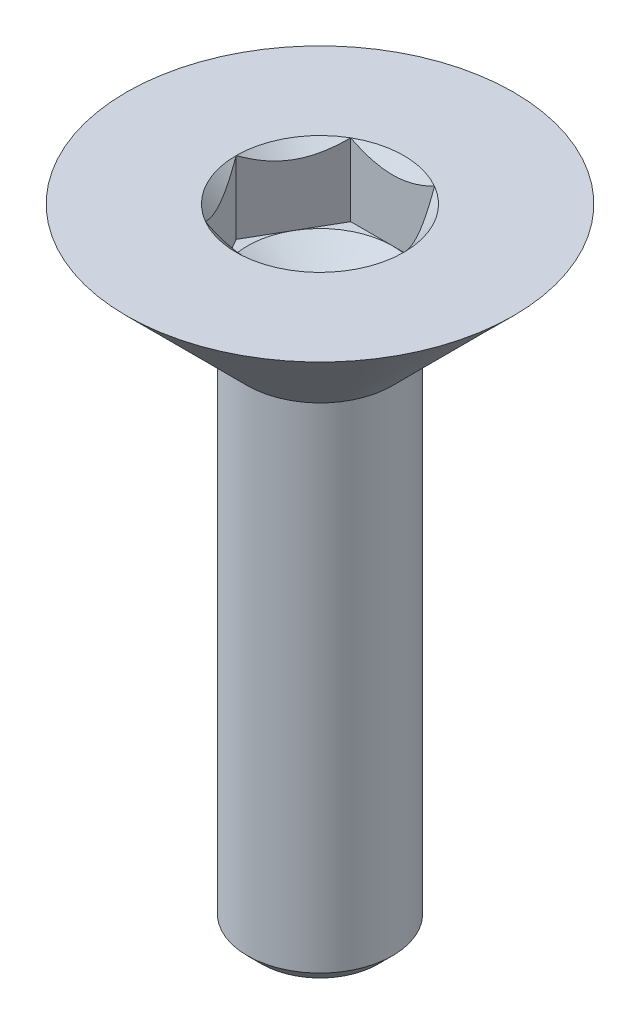
ISO-10303-21;
HEADER;
FILE_DESCRIPTION(('STEP AP214'),'2;1');
FILE_NAME('part.step','',(''),(''),'','','');
FILE_SCHEMA(('AUTOMOTIVE_DESIGN { 1 0 10303 214 1 1 1 1 }'));
ENDSEC;
DATA;
#1=APPLICATION_CONTEXT('core data for automotive mechanical design processes');
#2=APPLICATION_PROTOCOL_DEFINITION('international standard','automotive_design',2000,#1);
#3=PRODUCT_CONTEXT('',#1,'mechanical');
#4=PRODUCT('Part','Part','',(#3));
#5=PRODUCT_RELATED_PRODUCT_CATEGORY('part','',(#4));
#6=PRODUCT_DEFINITION_FORMATION('','',#4);
#7=PRODUCT_DEFINITION_CONTEXT('part definition',#1,'design');
#8=PRODUCT_DEFINITION('design','',#6,#7);
#9=PRODUCT_DEFINITION_SHAPE('','',#8);
#10=(LENGTH_UNIT() NAMED_UNIT(*) SI_UNIT(.MILLI.,.METRE.));
#11=(NAMED_UNIT(*) PLANE_ANGLE_UNIT() SI_UNIT($,.RADIAN.));
#12=(NAMED_UNIT(*) SI_UNIT($,.STERADIAN.) SOLID_ANGLE_UNIT());
#13=UNCERTAINTY_MEASURE_WITH_UNIT(LENGTH_MEASURE(1.E-05),#10,'distance_accuracy_value','');
#14=(GEOMETRIC_REPRESENTATION_CONTEXT(3) GLOBAL_UNCERTAINTY_ASSIGNED_CONTEXT((#13)) GLOBAL_UNIT_ASSIGNED_CONTEXT((#10,
#11,#12)) REPRESENTATION_CONTEXT('',''));
#15=CARTESIAN_POINT('',(0.,0.,0.));
#16=DIRECTION('',(0.,0.,1.));
#17=DIRECTION('',(1.,0.,0.));
#18=AXIS2_PLACEMENT_3D('',#15,#16,#17);
#19=CARTESIAN_POINT('',(3.46410161513775,2.,0.));
#20=DIRECTION('',(0.,1.,0.));
#21=DIRECTION('',(0.,0.,1.));
#22=AXIS2_PLACEMENT_3D('',#19,#20,#21);
#23=PLANE('',#22);
#24=CARTESIAN_POINT('',(0.,2.,0.));
#25=DIRECTION('',(0.,1.,0.));
#26=DIRECTION('',(0.,0.,1.));
#27=AXIS2_PLACEMENT_3D('',#24,#25,#26);
#28=CIRCLE('',#27,3.);
#29=CARTESIAN_POINT('',(0.,2.,3.));
#30=VERTEX_POINT('',#29);
#31=CARTESIAN_POINT('',(2.59807621135332,2.,1.5));
#32=VERTEX_POINT('',#31);
#33=EDGE_CURVE('E95',#30,#32,#28,.T.);
#34=ORIENTED_EDGE('',*,*,#33,.F.);
#35=DIRECTION('',(1.,0.,0.));
#36=VECTOR('',#35,1.);
#37=CARTESIAN_POINT('',(-1.73205080756888,2.,3.));
#38=LINE('',#37,#36);
#39=CARTESIAN_POINT('',(1.73205080756887,2.,3.));
#40=VERTEX_POINT('',#39);
#41=EDGE_CURVE('E39',#30,#40,#38,.T.);
#42=ORIENTED_EDGE('',*,*,#41,.T.);
#43=DIRECTION('',(0.5,0.,-0.866025403784439));
#44=VECTOR('',#43,1.);
#45=CARTESIAN_POINT('',(1.73205080756887,2.,3.));
#46=LINE('',#45,#44);
#47=EDGE_CURVE('E116',#40,#32,#46,.T.);
#48=ORIENTED_EDGE('',*,*,#47,.T.);
#49=EDGE_LOOP('',(#34,#42,#48));
#50=FACE_BOUND('',#49,.T.);
#51=ADVANCED_FACE('F16',(#50),#23,.T.);
#52=CARTESIAN_POINT('',(0.,2.,0.));
#53=DIRECTION('',(0.,1.,0.));
#54=DIRECTION('',(0.,0.,1.));
#55=AXIS2_PLACEMENT_3D('',#52,#53,#54);
#56=CIRCLE('',#55,3.);
#57=CARTESIAN_POINT('',(2.59807621135332,2.,-1.5));
#58=VERTEX_POINT('',#57);
#59=EDGE_CURVE('E97',#32,#58,#56,.T.);
#60=ORIENTED_EDGE('',*,*,#59,.F.);
#61=CARTESIAN_POINT('',(3.46410161513775,2.,0.));
#62=VERTEX_POINT('',#61);
#63=EDGE_CURVE('E106',#32,#62,#46,.T.);
#64=ORIENTED_EDGE('',*,*,#63,.T.);
#65=DIRECTION('',(-0.5,0.,-0.866025403784438));
#66=VECTOR('',#65,1.);
#67=CARTESIAN_POINT('',(3.46410161513775,2.,0.));
#68=LINE('',#67,#66);
#69=EDGE_CURVE('E109',#62,#58,#68,.T.);
#70=ORIENTED_EDGE('',*,*,#69,.T.);
#71=EDGE_LOOP('',(#60,#64,#70));
#72=FACE_BOUND('',#71,.T.);
#73=ADVANCED_FACE('F105',(#72),#23,.T.);
#74=CARTESIAN_POINT('',(0.,2.,-3.));
#75=VERTEX_POINT('',#74);
#76=EDGE_CURVE('E110',#58,#75,#56,.T.);
#77=ORIENTED_EDGE('',*,*,#76,.F.);
#78=CARTESIAN_POINT('',(1.73205080756887,2.,-3.));
#79=VERTEX_POINT('',#78);
#80=EDGE_CURVE('E122',#58,#79,#68,.T.);
#81=ORIENTED_EDGE('',*,*,#80,.T.);
#82=DIRECTION('',(-1.,0.,0.));
#83=VECTOR('',#82,1.);
#84=CARTESIAN_POINT('',(1.73205080756887,2.,-3.));
#85=LINE('',#84,#83);
#86=EDGE_CURVE('E128',#79,#75,#85,.T.);
#87=ORIENTED_EDGE('',*,*,#86,.T.);
#88=EDGE_LOOP('',(#77,#81,#87));
#89=FACE_BOUND('',#88,.T.);
#90=ADVANCED_FACE('F181',(#89),#23,.T.);
#91=CARTESIAN_POINT('',(-2.59807621135332,2.,-1.5));
#92=VERTEX_POINT('',#91);
#93=EDGE_CURVE('E211',#75,#92,#56,.T.);
#94=ORIENTED_EDGE('',*,*,#93,.F.);
#95=CARTESIAN_POINT('',(-1.73205080756888,2.,-3.));
#96=VERTEX_POINT('',#95);
#97=EDGE_CURVE('E127',#75,#96,#85,.T.);
#98=ORIENTED_EDGE('',*,*,#97,.T.);
#99=DIRECTION('',(-0.5,0.,0.866025403784439));
#100=VECTOR('',#99,1.);
#101=CARTESIAN_POINT('',(-1.73205080756888,2.,-3.));
#102=LINE('',#101,#100);
#103=EDGE_CURVE('E132',#96,#92,#102,.T.);
#104=ORIENTED_EDGE('',*,*,#103,.T.);
#105=EDGE_LOOP('',(#94,#98,#104));
#106=FACE_BOUND('',#105,.T.);
#107=ADVANCED_FACE('F199',(#106),#23,.T.);
#108=CARTESIAN_POINT('',(-2.59807621135332,2.,1.5));
#109=VERTEX_POINT('',#108);
#110=EDGE_CURVE('E31',#92,#109,#56,.T.);
#111=ORIENTED_EDGE('',*,*,#110,.F.);
#112=CARTESIAN_POINT('',(-3.46410161513775,2.,0.));
#113=VERTEX_POINT('',#112);
#114=EDGE_CURVE('E131',#92,#113,#102,.T.);
#115=ORIENTED_EDGE('',*,*,#114,.T.);
#116=DIRECTION('',(0.5,0.,0.866025403784439));
#117=VECTOR('',#116,1.);
#118=CARTESIAN_POINT('',(-3.46410161513775,2.,0.));
#119=LINE('',#118,#117);
#120=EDGE_CURVE('E136',#113,#109,#119,.T.);
#121=ORIENTED_EDGE('',*,*,#120,.T.);
#122=EDGE_LOOP('',(#111,#115,#121));
#123=FACE_BOUND('',#122,.T.);
#124=ADVANCED_FACE('F188',(#123),#23,.T.);
#125=CARTESIAN_POINT('',(0.,0.,0.));
#126=DIRECTION('',(0.,1.,0.));
#127=DIRECTION('',(0.,0.,1.));
#128=AXIS2_PLACEMENT_3D('',#125,#126,#127);
#129=CONICAL_SURFACE('',#128,3.,0.78539816339745);
#130=CARTESIAN_POINT('',(0.,5.,0.));
#131=DIRECTION('',(0.,1.,0.));
#132=DIRECTION('',(0.,0.,1.));
#133=AXIS2_PLACEMENT_3D('',#130,#131,#132);
#134=CIRCLE('',#133,8.);
#135=CARTESIAN_POINT('',(0.,5.,8.));
#136=VERTEX_POINT('',#135);
#137=EDGE_CURVE('E160',#136,#136,#134,.T.);
#138=ORIENTED_EDGE('',*,*,#137,.F.);
#139=EDGE_LOOP('',(#138));
#140=FACE_BOUND('',#139,.T.);
#141=CARTESIAN_POINT('',(0.,0.,0.));
#142=DIRECTION('',(0.,1.,0.));
#143=DIRECTION('',(0.,0.,1.));
#144=AXIS2_PLACEMENT_3D('',#141,#142,#143);
#145=CIRCLE('',#144,3.);
#146=CARTESIAN_POINT('',(0.,0.,3.));
#147=VERTEX_POINT('',#146);
#148=EDGE_CURVE('E144',#147,#147,#145,.T.);
#149=ORIENTED_EDGE('',*,*,#148,.T.);
#150=EDGE_LOOP('',(#149));
#151=FACE_BOUND('',#150,.T.);
#152=ADVANCED_FACE('F18',(#140,#151),#129,.T.);
#153=CARTESIAN_POINT('',(0.,5.,0.));
#154=DIRECTION('',(0.,1.,0.));
#155=DIRECTION('',(0.,0.,1.));
#156=AXIS2_PLACEMENT_3D('',#153,#154,#155);
#157=PLANE('',#156);
#158=CARTESIAN_POINT('',(0.,5.,0.));
#159=DIRECTION('',(0.,1.,0.));
#160=DIRECTION('',(0.,0.,1.));
#161=AXIS2_PLACEMENT_3D('',#158,#159,#160);
#162=CIRCLE('',#161,3.46410161513775);
#163=CARTESIAN_POINT('',(1.73205080756888,5.,3.));
#164=VERTEX_POINT('',#163);
#165=CARTESIAN_POINT('',(3.46410161513775,5.,0.));
#166=VERTEX_POINT('',#165);
#167=EDGE_CURVE('E100',#164,#166,#162,.T.);
#168=ORIENTED_EDGE('',*,*,#167,.F.);
#169=CARTESIAN_POINT('',(0.,5.,0.));
#170=DIRECTION('',(0.,1.,0.));
#171=DIRECTION('',(0.,0.,1.));
#172=AXIS2_PLACEMENT_3D('',#169,#170,#171);
#173=CIRCLE('',#172,3.46410161513775);
#174=CARTESIAN_POINT('',(-1.73205080756888,5.,3.));
#175=VERTEX_POINT('',#174);
#176=EDGE_CURVE('E120',#175,#164,#173,.T.);
#177=ORIENTED_EDGE('',*,*,#176,.F.);
#178=CARTESIAN_POINT('',(0.,5.,0.));
#179=DIRECTION('',(0.,1.,0.));
#180=DIRECTION('',(0.,0.,1.));
#181=AXIS2_PLACEMENT_3D('',#178,#179,#180);
#182=CIRCLE('',#181,3.46410161513775);
#183=CARTESIAN_POINT('',(-3.46410161513775,5.,0.));
#184=VERTEX_POINT('',#183);
#185=EDGE_CURVE('E236',#184,#175,#182,.T.);
#186=ORIENTED_EDGE('',*,*,#185,.F.);
#187=CARTESIAN_POINT('',(0.,5.,0.));
#188=DIRECTION('',(0.,1.,0.));
#189=DIRECTION('',(0.,0.,1.));
#190=AXIS2_PLACEMENT_3D('',#187,#188,#189);
#191=CIRCLE('',#190,3.46410161513775);
#192=CARTESIAN_POINT('',(-1.73205080756888,5.,-3.));
#193=VERTEX_POINT('',#192);
#194=EDGE_CURVE('E229',#193,#184,#191,.T.);
#195=ORIENTED_EDGE('',*,*,#194,.F.);
#196=CARTESIAN_POINT('',(0.,5.,0.));
#197=DIRECTION('',(0.,1.,0.));
#198=DIRECTION('',(0.,0.,1.));
#199=AXIS2_PLACEMENT_3D('',#196,#197,#198);
#200=CIRCLE('',#199,3.46410161513775);
#201=CARTESIAN_POINT('',(1.73205080756887,5.,-3.));
#202=VERTEX_POINT('',#201);
#203=EDGE_CURVE('E230',#202,#193,#200,.T.);
#204=ORIENTED_EDGE('',*,*,#203,.F.);
#205=CARTESIAN_POINT('',(0.,5.,0.));
#206=DIRECTION('',(0.,1.,0.));
#207=DIRECTION('',(0.,0.,1.));
#208=AXIS2_PLACEMENT_3D('',#205,#206,#207);
#209=CIRCLE('',#208,3.46410161513775);
#210=EDGE_CURVE('E264',#166,#202,#209,.T.);
#211=ORIENTED_EDGE('',*,*,#210,.F.);
#212=EDGE_LOOP('',(#168,#177,#186,#195,#204,#211));
#213=FACE_BOUND('',#212,.T.);
#214=ORIENTED_EDGE('',*,*,#137,.T.);
#215=EDGE_LOOP('',(#214));
#216=FACE_BOUND('',#215,.T.);
#217=ADVANCED_FACE('F205',(#213,#216),#157,.T.);
#218=CARTESIAN_POINT('',(0.,-21.,0.));
#219=DIRECTION('',(0.,1.,0.));
#220=DIRECTION('',(0.,0.,1.));
#221=AXIS2_PLACEMENT_3D('',#218,#219,#220);
#222=CYLINDRICAL_SURFACE('',#221,3.);
#223=CARTESIAN_POINT('',(0.,-20.4,0.));
#224=DIRECTION('',(0.,1.,0.));
#225=DIRECTION('',(0.,0.,1.));
#226=AXIS2_PLACEMENT_3D('',#223,#224,#225);
#227=CIRCLE('',#226,3.);
#228=CARTESIAN_POINT('',(0.,-20.4,3.));
#229=VERTEX_POINT('',#228);
#230=EDGE_CURVE('E24',#229,#229,#227,.T.);
#231=ORIENTED_EDGE('',*,*,#230,.T.);
#232=EDGE_LOOP('',(#231));
#233=FACE_BOUND('',#232,.T.);
#234=ORIENTED_EDGE('',*,*,#148,.F.);
#235=EDGE_LOOP('',(#234));
#236=FACE_BOUND('',#235,.T.);
#237=ADVANCED_FACE('F165',(#233,#236),#222,.T.);
#238=CARTESIAN_POINT('',(0.,-21.,0.));
#239=DIRECTION('',(0.,1.,0.));
#240=DIRECTION('',(0.,0.,1.));
#241=AXIS2_PLACEMENT_3D('',#238,#239,#240);
#242=PLANE('',#241);
#243=CARTESIAN_POINT('',(0.,-21.,0.));
#244=DIRECTION('',(0.,1.,0.));
#245=DIRECTION('',(0.,0.,1.));
#246=AXIS2_PLACEMENT_3D('',#243,#244,#245);
#247=CIRCLE('',#246,2.4);
#248=CARTESIAN_POINT('',(0.,-21.,2.4));
#249=VERTEX_POINT('',#248);
#250=EDGE_CURVE('E11',#249,#249,#247,.F.);
#251=ORIENTED_EDGE('',*,*,#250,.T.);
#252=EDGE_LOOP('',(#251));
#253=FACE_BOUND('',#252,.T.);
#254=ADVANCED_FACE('F404',(#253),#242,.F.);
#255=CARTESIAN_POINT('',(1.73205080756887,2.,3.));
#256=DIRECTION('',(0.866025403784439,0.,0.5));
#257=DIRECTION('',(0.5,0.,-0.866025403784439));
#258=AXIS2_PLACEMENT_3D('',#255,#256,#257);
#259=PLANE('',#258);
#260=DIRECTION('',(0.,1.,0.));
#261=VECTOR('',#260,1.);
#262=CARTESIAN_POINT('',(1.73205080756887,2.,3.));
#263=LINE('',#262,#261);
#264=EDGE_CURVE('E142',#40,#164,#263,.T.);
#265=ORIENTED_EDGE('',*,*,#264,.T.);
#266=CARTESIAN_POINT('',(3.4642170851916,5.00011547582715,-0.000200000000001995));
#267=CARTESIAN_POINT('',(3.40467869607211,4.94062831832179,0.102923514955745));
#268=CARTESIAN_POINT('',(3.3441447475778,4.88463497946552,0.207771389330647));
#269=CARTESIAN_POINT('',(3.22070940635329,4.78211259637894,0.421567671781093));
#270=CARTESIAN_POINT('',(3.15779627521275,4.73564059374129,0.530536411379758));
#271=CARTESIAN_POINT('',(3.03093496880241,4.6560331885163,0.750266639597028));
#272=CARTESIAN_POINT('',(2.96701910000606,4.62269770064267,0.860972171762211));
#273=CARTESIAN_POINT('',(2.83778025907546,4.5713375439793,1.08482041056532));
#274=CARTESIAN_POINT('',(2.77246123486019,4.5532745375356,1.19795627920699));
#275=CARTESIAN_POINT('',(2.65988677911464,4.53697690845049,1.3929409561927));
#276=CARTESIAN_POINT('',(2.6127767304643,4.5345643671738,1.47453795400213));
#277=CARTESIAN_POINT('',(2.51863325954798,4.53862943465711,1.63759922883009));
#278=CARTESIAN_POINT('',(2.47159986993094,4.5451101600283,1.71906344929899));
#279=CARTESIAN_POINT('',(2.37797867687426,4.56659172251522,1.88122011233837));
#280=CARTESIAN_POINT('',(2.33139143122689,4.58160208996728,1.9619115887843));
#281=CARTESIAN_POINT('',(2.23901705721438,4.61932364606601,2.12190869789133));
#282=CARTESIAN_POINT('',(2.19322986779049,4.64203424432283,2.2012144363093));
#283=CARTESIAN_POINT('',(2.11194373930153,4.68876068485394,2.34200614080275));
#284=CARTESIAN_POINT('',(2.07626488907772,4.7115483276808,2.40380372214603));
#285=CARTESIAN_POINT('',(2.00554773988155,4.76079628605744,2.52628941752022));
#286=CARTESIAN_POINT('',(1.97050946049033,4.78725671366619,2.5869774976356));
#287=CARTESIAN_POINT('',(1.90118383838355,4.84325699439136,2.70705299739086));
#288=CARTESIAN_POINT('',(1.86689452386372,4.87278716447837,2.76644383229592));
#289=CARTESIAN_POINT('',(1.79895094584794,4.93453909157553,2.88412556146727));
#290=CARTESIAN_POINT('',(1.76529630793217,4.96675919665936,2.94241710424773));
#291=CARTESIAN_POINT('',(1.73193533751504,5.00011547582715,3.0002));
#292=B_SPLINE_CURVE_WITH_KNOTS('',3,(#266,#267,#268,#269,#270,#271,#272,#273,#274,#275,#276,
#277,#278,#279,#280,#281,#282,#283,#284,#285,#286,#287,#288,#289,#290,#291),.UNSPECIFIED.,.F.,
.F.,(4,2,2,2,2,2,2,2,2,2,2,2,4),(0.,0.399603557139309,0.80153528639785,1.19708369162343,
1.59163620080173,1.87398941755845,2.15644160919093,2.43921001247426,2.72195674032139,
2.94657516661927,3.17120044767275,3.3951375283781,3.61893808380739),.UNSPECIFIED.);
#293=EDGE_CURVE('E255',#166,#164,#292,.T.);
#294=ORIENTED_EDGE('',*,*,#293,.F.);
#295=DIRECTION('',(0.,1.,0.));
#296=VECTOR('',#295,1.);
#297=CARTESIAN_POINT('',(3.46410161513775,2.,0.));
#298=LINE('',#297,#296);
#299=EDGE_CURVE('E119',#62,#166,#298,.T.);
#300=ORIENTED_EDGE('',*,*,#299,.F.);
#301=ORIENTED_EDGE('',*,*,#63,.F.);
#302=ORIENTED_EDGE('',*,*,#47,.F.);
#303=EDGE_LOOP('',(#265,#294,#300,#301,#302));
#304=FACE_BOUND('',#303,.T.);
#305=ADVANCED_FACE('F115',(#304),#259,.F.);
#306=CARTESIAN_POINT('',(-1.73205080756888,2.,3.));
#307=DIRECTION('',(0.,0.,1.));
#308=DIRECTION('',(1.,0.,0.));
#309=AXIS2_PLACEMENT_3D('',#306,#307,#308);
#310=PLANE('',#309);
#311=DIRECTION('',(0.,1.,0.));
#312=VECTOR('',#311,1.);
#313=CARTESIAN_POINT('',(-1.73205080756888,2.,3.));
#314=LINE('',#313,#312);
#315=CARTESIAN_POINT('',(-1.73205080756888,2.,3.));
#316=VERTEX_POINT('',#315);
#317=EDGE_CURVE('E145',#316,#175,#314,.T.);
#318=ORIENTED_EDGE('',*,*,#317,.T.);
#319=CARTESIAN_POINT('',(-3.50026189213971,6.14586945999552,3.));
#320=CARTESIAN_POINT('',(-3.41523785997635,6.08132698713014,3.));
#321=CARTESIAN_POINT('',(-3.32974294686505,6.01739482944916,3.));
#322=CARTESIAN_POINT('',(-3.1576236484576,5.89102603081563,3.));
#323=CARTESIAN_POINT('',(-3.07099898964627,5.82858976280715,3.));
#324=CARTESIAN_POINT('',(-2.89579876143019,5.70504340848415,3.));
#325=CARTESIAN_POINT('',(-2.80721328064141,5.64394733027367,3.));
#326=CARTESIAN_POINT('',(-2.62854680280642,5.52398973492908,3.));
#327=CARTESIAN_POINT('',(-2.53846591122011,5.4651280611736,3.));
#328=CARTESIAN_POINT('',(-2.35119236495089,5.34674237560163,3.));
#329=CARTESIAN_POINT('',(-2.25389399968267,5.28738473954988,3.));
#330=CARTESIAN_POINT('',(-2.05704987810791,5.17252661486392,3.));
#331=CARTESIAN_POINT('',(-1.95750441953902,5.11702561915699,3.));
#332=CARTESIAN_POINT('',(-1.7561226985642,5.01104681943707,3.));
#333=CARTESIAN_POINT('',(-1.654293905609,4.96055493305977,3.));
#334=CARTESIAN_POINT('',(-1.4478291264739,4.8657342159027,3.));
#335=CARTESIAN_POINT('',(-1.34319445345303,4.82140256016219,3.));
#336=CARTESIAN_POINT('',(-1.14005723492101,4.7439653868705,3.));
#337=CARTESIAN_POINT('',(-1.04180014025537,4.71022262197284,3.));
#338=CARTESIAN_POINT('',(-0.842880246470667,4.65061383231056,3.));
#339=CARTESIAN_POINT('',(-0.742217285955499,4.62474833759658,3.));
#340=CARTESIAN_POINT('',(-0.540783319110627,4.58268913605691,3.));
#341=CARTESIAN_POINT('',(-0.440048092571994,4.56632688716289,3.));
#342=CARTESIAN_POINT('',(-0.23745012621826,4.54359904909687,3.));
#343=CARTESIAN_POINT('',(-0.135587594567487,4.53723164433459,3.));
#344=CARTESIAN_POINT('',(0.0643530663139394,4.53498673052191,3.));
#345=CARTESIAN_POINT('',(0.162426910524714,4.53871728099802,3.));
#346=CARTESIAN_POINT('',(0.357756730279379,4.5555865264109,3.));
#347=CARTESIAN_POINT('',(0.455012626861413,4.56872611935222,3.));
#348=CARTESIAN_POINT('',(0.64964782195623,4.60391252493135,3.));
#349=CARTESIAN_POINT('',(0.746998971732529,4.62611253164947,3.));
#350=CARTESIAN_POINT('',(0.939574143610771,4.67822215363051,3.));
#351=CARTESIAN_POINT('',(1.03479832705956,4.70813118193143,3.));
#352=CARTESIAN_POINT('',(1.23072205644054,4.77713022973262,3.));
#353=CARTESIAN_POINT('',(1.33122436862621,4.81677445714142,3.));
#354=CARTESIAN_POINT('',(1.52961364970361,4.9021565946098,3.));
#355=CARTESIAN_POINT('',(1.627499740881,4.94789651965282,3.));
#356=CARTESIAN_POINT('',(1.82115087324603,5.04439091052342,3.));
#357=CARTESIAN_POINT('',(1.91690786943231,5.09516139139943,3.));
#358=CARTESIAN_POINT('',(2.10621926622503,5.2005921852541,3.));
#359=CARTESIAN_POINT('',(2.19977405676324,5.2552518026054,3.));
#360=CARTESIAN_POINT('',(2.38037956263871,5.36490860550233,3.));
#361=CARTESIAN_POINT('',(2.46752265708672,5.4197544450927,3.));
#362=CARTESIAN_POINT('',(2.64031239190302,5.53176179216328,3.));
#363=CARTESIAN_POINT('',(2.72595891856191,5.58892347451589,3.));
#364=CARTESIAN_POINT('',(2.89525866161974,5.70467887234542,3.));
#365=CARTESIAN_POINT('',(2.97892240073228,5.76325725287113,3.));
#366=CARTESIAN_POINT('',(3.14510504112315,5.8819701069399,3.));
#367=CARTESIAN_POINT('',(3.22762425118593,5.94210414772102,3.));
#368=CARTESIAN_POINT('',(3.30966391558316,6.0028744575666,3.));
#369=B_SPLINE_CURVE_WITH_KNOTS('',3,(#319,#320,#321,#322,#323,#324,#325,#326,#327,#328,#329,
#330,#331,#332,#333,#334,#335,#336,#337,#338,#339,#340,#341,#342,#343,#344,#345,#346,#347,#348,
#349,#350,#351,#352,#353,#354,#355,#356,#357,#358,#359,#360,#361,#362,#363,#364,#365,#366,#367,
#368),.UNSPECIFIED.,.F.,.F.,(4,2,2,2,2,2,2,2,2,2,2,2,2,2,2,2,2,2,2,2,2,2,2,2,4),(0.,
0.320245722442128,0.640570472390091,0.963374962124773,1.28615678282538,1.62801128110889,
1.96982074683625,2.31064028307512,2.65130300670841,2.96269931594175,3.27411657397538,
3.57982738441454,3.88548265523487,4.17944606578094,4.473437536108,4.77262056497119,
5.07178082087711,5.39564608126813,5.71961866478729,6.04465796371951,6.36963927019528,
6.67849410463418,6.98737230474517,7.29375054281863,7.60004444848992),.UNSPECIFIED.);
#370=EDGE_CURVE('E247',#164,#175,#369,.F.);
#371=ORIENTED_EDGE('',*,*,#370,.F.);
#372=ORIENTED_EDGE('',*,*,#264,.F.);
#373=ORIENTED_EDGE('',*,*,#41,.F.);
#374=EDGE_CURVE('E139',#316,#30,#38,.T.);
#375=ORIENTED_EDGE('',*,*,#374,.F.);
#376=EDGE_LOOP('',(#318,#371,#372,#373,#375));
#377=FACE_BOUND('',#376,.T.);
#378=ADVANCED_FACE('F253',(#377),#310,.F.);
#379=CARTESIAN_POINT('',(-3.46410161513775,2.,0.));
#380=DIRECTION('',(-0.866025403784439,0.,0.5));
#381=DIRECTION('',(0.5,0.,0.866025403784439));
#382=AXIS2_PLACEMENT_3D('',#379,#380,#381);
#383=PLANE('',#382);
#384=DIRECTION('',(0.,1.,0.));
#385=VECTOR('',#384,1.);
#386=CARTESIAN_POINT('',(-3.46410161513775,2.,0.));
#387=LINE('',#386,#385);
#388=EDGE_CURVE('E148',#113,#184,#387,.T.);
#389=ORIENTED_EDGE('',*,*,#388,.T.);
#390=CARTESIAN_POINT('',(-1.73193533751504,5.00011547582715,3.0002));
#391=CARTESIAN_POINT('',(-1.79147372663452,4.94062831832179,2.89707648504425));
#392=CARTESIAN_POINT('',(-1.85200767512883,4.88463497946552,2.79222861066935));
#393=CARTESIAN_POINT('',(-1.97544301635334,4.78211259637894,2.5784323282189));
#394=CARTESIAN_POINT('',(-2.03835614749388,4.73564059374129,2.46946358862024));
#395=CARTESIAN_POINT('',(-2.16521745390422,4.6560331885163,2.24973336040297));
#396=CARTESIAN_POINT('',(-2.22913332270057,4.62269770064267,2.13902782823779));
#397=CARTESIAN_POINT('',(-2.35837216363117,4.5713375439793,1.91517958943467));
#398=CARTESIAN_POINT('',(-2.42369118784644,4.5532745375356,1.80204372079301));
#399=CARTESIAN_POINT('',(-2.53626564359199,4.53697690845049,1.6070590438073));
#400=CARTESIAN_POINT('',(-2.58337569224233,4.53456436717381,1.52546204599786));
#401=CARTESIAN_POINT('',(-2.67751916315865,4.53862943465712,1.36240077116991));
#402=CARTESIAN_POINT('',(-2.7245525527757,4.54511016002831,1.28093655070101));
#403=CARTESIAN_POINT('',(-2.81817374583238,4.56659172251522,1.11877988766163));
#404=CARTESIAN_POINT('',(-2.86476099147974,4.58160208996728,1.03808841121569));
#405=CARTESIAN_POINT('',(-2.95713536549225,4.61932364606602,0.878091302108661));
#406=CARTESIAN_POINT('',(-3.00292255491614,4.64203424432283,0.798785563690701));
#407=CARTESIAN_POINT('',(-3.08420868340511,4.68876068485394,0.657993859197244));
#408=CARTESIAN_POINT('',(-3.11988753362891,4.7115483276808,0.596196277853971));
#409=CARTESIAN_POINT('',(-3.19060468282508,4.76079628605745,0.473710582479778));
#410=CARTESIAN_POINT('',(-3.2256429622163,4.7872567136662,0.413022502364395));
#411=CARTESIAN_POINT('',(-3.29496858432308,4.84325699439136,0.292947002609136));
#412=CARTESIAN_POINT('',(-3.32925789884291,4.87278716447837,0.233556167704081));
#413=CARTESIAN_POINT('',(-3.39720147685869,4.93453909157553,0.115874438532731));
#414=CARTESIAN_POINT('',(-3.43085611477446,4.96675919665936,0.0575828957522662));
#415=CARTESIAN_POINT('',(-3.46421708519159,5.00011547582715,-0.00019999999999915));
#416=B_SPLINE_CURVE_WITH_KNOTS('',3,(#390,#391,#392,#393,#394,#395,#396,#397,#398,#399,#400,
#401,#402,#403,#404,#405,#406,#407,#408,#409,#410,#411,#412,#413,#414,#415),.UNSPECIFIED.,.F.,
.F.,(4,2,2,2,2,2,2,2,2,2,2,2,4),(0.,0.399603557139307,0.801535286397849,1.19708369162343,
1.59163620080173,1.87398941755845,2.15644160919093,2.43921001247426,2.72195674032139,
2.94657516661927,3.17120044767274,3.3951375283781,3.61893808380739),.UNSPECIFIED.);
#417=EDGE_CURVE('E234',#175,#184,#416,.T.);
#418=ORIENTED_EDGE('',*,*,#417,.F.);
#419=ORIENTED_EDGE('',*,*,#317,.F.);
#420=EDGE_CURVE('E135',#109,#316,#119,.T.);
#421=ORIENTED_EDGE('',*,*,#420,.F.);
#422=ORIENTED_EDGE('',*,*,#120,.F.);
#423=EDGE_LOOP('',(#389,#418,#419,#421,#422));
#424=FACE_BOUND('',#423,.T.);
#425=ADVANCED_FACE('F249',(#424),#383,.F.);
#426=CARTESIAN_POINT('',(-1.73205080756888,2.,-3.));
#427=DIRECTION('',(-0.866025403784439,0.,-0.5));
#428=DIRECTION('',(-0.5,0.,0.866025403784439));
#429=AXIS2_PLACEMENT_3D('',#426,#427,#428);
#430=PLANE('',#429);
#431=DIRECTION('',(0.,1.,0.));
#432=VECTOR('',#431,1.);
#433=CARTESIAN_POINT('',(-1.73205080756888,2.,-3.));
#434=LINE('',#433,#432);
#435=EDGE_CURVE('E151',#96,#193,#434,.T.);
#436=ORIENTED_EDGE('',*,*,#435,.T.);
#437=CARTESIAN_POINT('',(-3.4642170851916,5.00011547582715,0.00020000000000065));
#438=CARTESIAN_POINT('',(-3.40467869607211,4.94062831832179,-0.102923514955748));
#439=CARTESIAN_POINT('',(-3.3441447475778,4.88463497946552,-0.20777138933065));
#440=CARTESIAN_POINT('',(-3.2207094063533,4.78211259637894,-0.421567671781096));
#441=CARTESIAN_POINT('',(-3.15779627521275,4.73564059374129,-0.53053641137976));
#442=CARTESIAN_POINT('',(-3.03093496880242,4.6560331885163,-0.750266639597029));
#443=CARTESIAN_POINT('',(-2.96701910000607,4.62269770064267,-0.860972171762213));
#444=CARTESIAN_POINT('',(-2.83778025907547,4.57133754397931,-1.08482041056533));
#445=CARTESIAN_POINT('',(-2.77246123486019,4.55327453753561,-1.19795627920699));
#446=CARTESIAN_POINT('',(-2.65988677911464,4.5369769084505,-1.3929409561927));
#447=CARTESIAN_POINT('',(-2.6127767304643,4.53456436717381,-1.47453795400214));
#448=CARTESIAN_POINT('',(-2.51863325954798,4.53862943465712,-1.63759922883009));
#449=CARTESIAN_POINT('',(-2.47159986993094,4.54511016002831,-1.71906344929899));
#450=CARTESIAN_POINT('',(-2.37797867687426,4.56659172251523,-1.88122011233837));
#451=CARTESIAN_POINT('',(-2.33139143122689,4.58160208996728,-1.96191158878431));
#452=CARTESIAN_POINT('',(-2.23901705721438,4.61932364606602,-2.12190869789134));
#453=CARTESIAN_POINT('',(-2.19322986779049,4.64203424432283,-2.2012144363093));
#454=CARTESIAN_POINT('',(-2.11194373930153,4.68876068485394,-2.34200614080276));
#455=CARTESIAN_POINT('',(-2.07626488907772,4.7115483276808,-2.40380372214603));
#456=CARTESIAN_POINT('',(-2.00554773988155,4.76079628605745,-2.52628941752022));
#457=CARTESIAN_POINT('',(-1.97050946049034,4.7872567136662,-2.58697749763561));
#458=CARTESIAN_POINT('',(-1.90118383838356,4.84325699439136,-2.70705299739087));
#459=CARTESIAN_POINT('',(-1.86689452386373,4.87278716447837,-2.76644383229592));
#460=CARTESIAN_POINT('',(-1.79895094584795,4.93453909157553,-2.88412556146727));
#461=CARTESIAN_POINT('',(-1.76529630793217,4.96675919665936,-2.94241710424774));
#462=CARTESIAN_POINT('',(-1.73193533751504,5.00011547582715,-3.0002));
#463=B_SPLINE_CURVE_WITH_KNOTS('',3,(#437,#438,#439,#440,#441,#442,#443,#444,#445,#446,#447,
#448,#449,#450,#451,#452,#453,#454,#455,#456,#457,#458,#459,#460,#461,#462),.UNSPECIFIED.,.F.,
.F.,(4,2,2,2,2,2,2,2,2,2,2,2,4),(0.,0.399603557139307,0.801535286397845,1.19708369162343,
1.59163620080173,1.87398941755845,2.15644160919093,2.43921001247426,2.72195674032139,
2.94657516661927,3.17120044767275,3.3951375283781,3.61893808380739),.UNSPECIFIED.);
#464=EDGE_CURVE('E225',#184,#193,#463,.T.);
#465=ORIENTED_EDGE('',*,*,#464,.F.);
#466=ORIENTED_EDGE('',*,*,#388,.F.);
#467=ORIENTED_EDGE('',*,*,#114,.F.);
#468=ORIENTED_EDGE('',*,*,#103,.F.);
#469=EDGE_LOOP('',(#436,#465,#466,#467,#468));
#470=FACE_BOUND('',#469,.T.);
#471=ADVANCED_FACE('F214',(#470),#430,.F.);
#472=CARTESIAN_POINT('',(1.73205080756887,2.,-3.));
#473=DIRECTION('',(0.,0.,-1.));
#474=DIRECTION('',(-1.,0.,0.));
#475=AXIS2_PLACEMENT_3D('',#472,#473,#474);
#476=PLANE('',#475);
#477=DIRECTION('',(0.,1.,0.));
#478=VECTOR('',#477,1.);
#479=CARTESIAN_POINT('',(1.73205080756887,2.,-3.));
#480=LINE('',#479,#478);
#481=EDGE_CURVE('E154',#79,#202,#480,.T.);
#482=ORIENTED_EDGE('',*,*,#481,.T.);
#483=CARTESIAN_POINT('',(-3.50026189213971,6.14586945999552,-3.));
#484=CARTESIAN_POINT('',(-3.41523785997635,6.08132698713014,-3.));
#485=CARTESIAN_POINT('',(-3.32974294686505,6.01739482944916,-3.));
#486=CARTESIAN_POINT('',(-3.1576236484576,5.89102603081563,-3.));
#487=CARTESIAN_POINT('',(-3.07099898964627,5.82858976280715,-3.));
#488=CARTESIAN_POINT('',(-2.89579876143019,5.70504340848415,-3.));
#489=CARTESIAN_POINT('',(-2.80721328064141,5.64394733027367,-3.));
#490=CARTESIAN_POINT('',(-2.62854680280642,5.52398973492908,-3.));
#491=CARTESIAN_POINT('',(-2.53846591122011,5.4651280611736,-3.));
#492=CARTESIAN_POINT('',(-2.35119236495089,5.34674237560163,-3.));
#493=CARTESIAN_POINT('',(-2.25389399968267,5.28738473954988,-3.));
#494=CARTESIAN_POINT('',(-2.05704987810791,5.17252661486392,-3.));
#495=CARTESIAN_POINT('',(-1.95750441953902,5.11702561915699,-3.));
#496=CARTESIAN_POINT('',(-1.7561226985642,5.01104681943707,-3.));
#497=CARTESIAN_POINT('',(-1.654293905609,4.96055493305977,-3.));
#498=CARTESIAN_POINT('',(-1.4478291264739,4.8657342159027,-3.));
#499=CARTESIAN_POINT('',(-1.34319445345303,4.82140256016219,-3.));
#500=CARTESIAN_POINT('',(-1.14005723492101,4.7439653868705,-3.));
#501=CARTESIAN_POINT('',(-1.04180014025537,4.71022262197284,-3.));
#502=CARTESIAN_POINT('',(-0.842880246470667,4.65061383231056,-3.));
#503=CARTESIAN_POINT('',(-0.742217285955499,4.62474833759658,-3.));
#504=CARTESIAN_POINT('',(-0.540783319110627,4.58268913605691,-3.));
#505=CARTESIAN_POINT('',(-0.440048092571994,4.56632688716289,-3.));
#506=CARTESIAN_POINT('',(-0.237450126218261,4.54359904909687,-3.));
#507=CARTESIAN_POINT('',(-0.135587594567487,4.53723164433459,-3.));
#508=CARTESIAN_POINT('',(0.0643530663139388,4.53498673052191,-3.));
#509=CARTESIAN_POINT('',(0.162426910524713,4.53871728099802,-3.));
#510=CARTESIAN_POINT('',(0.357756730279378,4.5555865264109,-3.));
#511=CARTESIAN_POINT('',(0.455012626861413,4.56872611935222,-3.));
#512=CARTESIAN_POINT('',(0.64964782195623,4.60391252493135,-3.));
#513=CARTESIAN_POINT('',(0.746998971732529,4.62611253164947,-3.));
#514=CARTESIAN_POINT('',(0.93957414361077,4.67822215363051,-3.));
#515=CARTESIAN_POINT('',(1.03479832705956,4.70813118193143,-3.));
#516=CARTESIAN_POINT('',(1.23072205644054,4.77713022973262,-3.));
#517=CARTESIAN_POINT('',(1.33122436862621,4.81677445714142,-3.));
#518=CARTESIAN_POINT('',(1.52961364970361,4.9021565946098,-3.));
#519=CARTESIAN_POINT('',(1.627499740881,4.94789651965281,-3.));
#520=CARTESIAN_POINT('',(1.82115087324603,5.04439091052342,-3.));
#521=CARTESIAN_POINT('',(1.91690786943231,5.09516139139942,-3.));
#522=CARTESIAN_POINT('',(2.10621926622503,5.2005921852541,-3.));
#523=CARTESIAN_POINT('',(2.19977405676323,5.2552518026054,-3.));
#524=CARTESIAN_POINT('',(2.38037956263871,5.36490860550233,-3.));
#525=CARTESIAN_POINT('',(2.46752265708672,5.4197544450927,-3.));
#526=CARTESIAN_POINT('',(2.64031239190302,5.53176179216328,-3.));
#527=CARTESIAN_POINT('',(2.72595891856191,5.58892347451588,-3.));
#528=CARTESIAN_POINT('',(2.89525866161974,5.70467887234542,-3.));
#529=CARTESIAN_POINT('',(2.97892240073228,5.76325725287113,-3.));
#530=CARTESIAN_POINT('',(3.14510504112315,5.8819701069399,-3.));
#531=CARTESIAN_POINT('',(3.22762425118592,5.94210414772102,-3.));
#532=CARTESIAN_POINT('',(3.30966391558316,6.0028744575666,-3.));
#533=B_SPLINE_CURVE_WITH_KNOTS('',3,(#483,#484,#485,#486,#487,#488,#489,#490,#491,#492,#493,
#494,#495,#496,#497,#498,#499,#500,#501,#502,#503,#504,#505,#506,#507,#508,#509,#510,#511,#512,
#513,#514,#515,#516,#517,#518,#519,#520,#521,#522,#523,#524,#525,#526,#527,#528,#529,#530,#531,
#532),.UNSPECIFIED.,.F.,.F.,(4,2,2,2,2,2,2,2,2,2,2,2,2,2,2,2,2,2,2,2,2,2,2,2,4),(0.,
0.32024572244213,0.640570472390093,0.963374962124776,1.28615678282539,1.62801128110889,
1.96982074683625,2.31064028307512,2.65130300670842,2.96269931594175,3.27411657397538,
3.57982738441454,3.88548265523487,4.17944606578094,4.473437536108,4.7726205649712,
5.07178082087711,5.39564608126813,5.71961866478729,6.04465796371952,6.36963927019528,
6.67849410463418,6.98737230474518,7.29375054281863,7.60004444848991),.UNSPECIFIED.);
#534=EDGE_CURVE('E223',#193,#202,#533,.T.);
#535=ORIENTED_EDGE('',*,*,#534,.F.);
#536=ORIENTED_EDGE('',*,*,#435,.F.);
#537=ORIENTED_EDGE('',*,*,#97,.F.);
#538=ORIENTED_EDGE('',*,*,#86,.F.);
#539=EDGE_LOOP('',(#482,#535,#536,#537,#538));
#540=FACE_BOUND('',#539,.T.);
#541=ADVANCED_FACE('F195',(#540),#476,.F.);
#542=CARTESIAN_POINT('',(3.46410161513775,2.,0.));
#543=DIRECTION('',(0.866025403784438,0.,-0.5));
#544=DIRECTION('',(-0.5,0.,-0.866025403784438));
#545=AXIS2_PLACEMENT_3D('',#542,#543,#544);
#546=PLANE('',#545);
#547=ORIENTED_EDGE('',*,*,#299,.T.);
#548=CARTESIAN_POINT('',(1.73193533751504,5.00011547582715,-3.0002));
#549=CARTESIAN_POINT('',(1.79147372663452,4.94062831832179,-2.89707648504425));
#550=CARTESIAN_POINT('',(1.85200767512883,4.88463497946552,-2.79222861066935));
#551=CARTESIAN_POINT('',(1.97544301635334,4.78211259637894,-2.57843232821891));
#552=CARTESIAN_POINT('',(2.03835614749388,4.73564059374129,-2.46946358862024));
#553=CARTESIAN_POINT('',(2.16521745390422,4.6560331885163,-2.24973336040297));
#554=CARTESIAN_POINT('',(2.22913332270057,4.62269770064267,-2.13902782823779));
#555=CARTESIAN_POINT('',(2.35837216363117,4.57133754397931,-1.91517958943468));
#556=CARTESIAN_POINT('',(2.42369118784644,4.55327453753561,-1.80204372079301));
#557=CARTESIAN_POINT('',(2.53626564359199,4.5369769084505,-1.6070590438073));
#558=CARTESIAN_POINT('',(2.58337569224233,4.53456436717381,-1.52546204599787));
#559=CARTESIAN_POINT('',(2.67751916315865,4.53862943465711,-1.36240077116991));
#560=CARTESIAN_POINT('',(2.7245525527757,4.54511016002831,-1.28093655070101));
#561=CARTESIAN_POINT('',(2.81817374583237,4.56659172251523,-1.11877988766163));
#562=CARTESIAN_POINT('',(2.86476099147974,4.58160208996728,-1.0380884112157));
#563=CARTESIAN_POINT('',(2.95713536549225,4.61932364606601,-0.878091302108665));
#564=CARTESIAN_POINT('',(3.00292255491614,4.64203424432283,-0.798785563690704));
#565=CARTESIAN_POINT('',(3.0842086834051,4.68876068485394,-0.657993859197248));
#566=CARTESIAN_POINT('',(3.11988753362891,4.7115483276808,-0.596196277853975));
#567=CARTESIAN_POINT('',(3.19060468282508,4.76079628605745,-0.473710582479782));
#568=CARTESIAN_POINT('',(3.2256429622163,4.7872567136662,-0.413022502364398));
#569=CARTESIAN_POINT('',(3.29496858432308,4.84325699439136,-0.292947002609138));
#570=CARTESIAN_POINT('',(3.32925789884291,4.87278716447837,-0.233556167704083));
#571=CARTESIAN_POINT('',(3.39720147685869,4.93453909157553,-0.115874438532732));
#572=CARTESIAN_POINT('',(3.43085611477447,4.96675919665936,-0.0575828957522672));
#573=CARTESIAN_POINT('',(3.4642170851916,5.00011547582715,0.000199999999997565));
#574=B_SPLINE_CURVE_WITH_KNOTS('',3,(#548,#549,#550,#551,#552,#553,#554,#555,#556,#557,#558,
#559,#560,#561,#562,#563,#564,#565,#566,#567,#568,#569,#570,#571,#572,#573),.UNSPECIFIED.,.F.,
.F.,(4,2,2,2,2,2,2,2,2,2,2,2,4),(0.,0.399603557139306,0.801535286397844,1.19708369162343,
1.59163620080173,1.87398941755844,2.15644160919093,2.43921001247425,2.72195674032138,
2.94657516661926,3.17120044767274,3.3951375283781,3.61893808380739),.UNSPECIFIED.);
#575=EDGE_CURVE('E258',#202,#166,#574,.T.);
#576=ORIENTED_EDGE('',*,*,#575,.F.);
#577=ORIENTED_EDGE('',*,*,#481,.F.);
#578=ORIENTED_EDGE('',*,*,#80,.F.);
#579=ORIENTED_EDGE('',*,*,#69,.F.);
#580=EDGE_LOOP('',(#547,#576,#577,#578,#579));
#581=FACE_BOUND('',#580,.T.);
#582=ADVANCED_FACE('F186',(#581),#546,.F.);
#583=EDGE_CURVE('E99',#109,#30,#56,.T.);
#584=ORIENTED_EDGE('',*,*,#583,.F.);
#585=ORIENTED_EDGE('',*,*,#420,.T.);
#586=ORIENTED_EDGE('',*,*,#374,.T.);
#587=EDGE_LOOP('',(#584,#585,#586));
#588=FACE_BOUND('',#587,.T.);
#589=ADVANCED_FACE('F177',(#588),#23,.T.);
#590=CARTESIAN_POINT('',(0.,5.,0.));
#591=DIRECTION('',(0.,1.,0.));
#592=DIRECTION('',(0.,0.,1.));
#593=AXIS2_PLACEMENT_3D('',#590,#591,#592);
#594=CONICAL_SURFACE('',#593,3.46410161513775,0.78539816339745);
#595=ORIENTED_EDGE('',*,*,#370,.T.);
#596=ORIENTED_EDGE('',*,*,#176,.T.);
#597=EDGE_LOOP('',(#595,#596));
#598=FACE_BOUND('',#597,.T.);
#599=ADVANCED_FACE('F185',(#598),#594,.F.);
#600=CARTESIAN_POINT('',(0.,5.,0.));
#601=DIRECTION('',(0.,1.,0.));
#602=DIRECTION('',(0.,0.,1.));
#603=AXIS2_PLACEMENT_3D('',#600,#601,#602);
#604=CONICAL_SURFACE('',#603,3.46410161513775,0.78539816339745);
#605=ORIENTED_EDGE('',*,*,#417,.T.);
#606=ORIENTED_EDGE('',*,*,#185,.T.);
#607=EDGE_LOOP('',(#605,#606));
#608=FACE_BOUND('',#607,.T.);
#609=ADVANCED_FACE('F193',(#608),#604,.F.);
#610=CARTESIAN_POINT('',(0.,5.,0.));
#611=DIRECTION('',(0.,1.,0.));
#612=DIRECTION('',(0.,0.,1.));
#613=AXIS2_PLACEMENT_3D('',#610,#611,#612);
#614=CONICAL_SURFACE('',#613,3.46410161513775,0.78539816339745);
#615=ORIENTED_EDGE('',*,*,#464,.T.);
#616=ORIENTED_EDGE('',*,*,#194,.T.);
#617=EDGE_LOOP('',(#615,#616));
#618=FACE_BOUND('',#617,.T.);
#619=ADVANCED_FACE('F352',(#618),#614,.F.);
#620=CARTESIAN_POINT('',(0.,5.,0.));
#621=DIRECTION('',(0.,1.,0.));
#622=DIRECTION('',(0.,0.,1.));
#623=AXIS2_PLACEMENT_3D('',#620,#621,#622);
#624=CONICAL_SURFACE('',#623,3.46410161513775,0.78539816339745);
#625=ORIENTED_EDGE('',*,*,#534,.T.);
#626=ORIENTED_EDGE('',*,*,#203,.T.);
#627=EDGE_LOOP('',(#625,#626));
#628=FACE_BOUND('',#627,.T.);
#629=ADVANCED_FACE('F345',(#628),#624,.F.);
#630=CARTESIAN_POINT('',(0.,5.,0.));
#631=DIRECTION('',(0.,1.,0.));
#632=DIRECTION('',(0.,0.,1.));
#633=AXIS2_PLACEMENT_3D('',#630,#631,#632);
#634=CONICAL_SURFACE('',#633,3.46410161513775,0.78539816339745);
#635=ORIENTED_EDGE('',*,*,#575,.T.);
#636=ORIENTED_EDGE('',*,*,#210,.T.);
#637=EDGE_LOOP('',(#635,#636));
#638=FACE_BOUND('',#637,.T.);
#639=ADVANCED_FACE('F263',(#638),#634,.F.);
#640=CARTESIAN_POINT('',(0.,5.,0.));
#641=DIRECTION('',(0.,1.,0.));
#642=DIRECTION('',(0.,0.,1.));
#643=AXIS2_PLACEMENT_3D('',#640,#641,#642);
#644=CONICAL_SURFACE('',#643,3.46410161513775,0.78539816339745);
#645=ORIENTED_EDGE('',*,*,#293,.T.);
#646=ORIENTED_EDGE('',*,*,#167,.T.);
#647=EDGE_LOOP('',(#645,#646));
#648=FACE_BOUND('',#647,.T.);
#649=ADVANCED_FACE('F93',(#648),#644,.F.);
#650=CARTESIAN_POINT('',(0.,2.,0.));
#651=DIRECTION('',(0.,1.,0.));
#652=DIRECTION('',(0.,0.,1.));
#653=AXIS2_PLACEMENT_3D('',#650,#651,#652);
#654=CONICAL_SURFACE('',#653,3.,1.0471975511966);
#655=CARTESIAN_POINT('',(0.,0.267949192431133,0.));
#656=VERTEX_POINT('',#655);
#657=VERTEX_LOOP('',#656);
#658=FACE_BOUND('',#657,.T.);
#659=ORIENTED_EDGE('',*,*,#33,.T.);
#660=ORIENTED_EDGE('',*,*,#59,.T.);
#661=ORIENTED_EDGE('',*,*,#76,.T.);
#662=ORIENTED_EDGE('',*,*,#93,.T.);
#663=ORIENTED_EDGE('',*,*,#110,.T.);
#664=ORIENTED_EDGE('',*,*,#583,.T.);
#665=EDGE_LOOP('',(#659,#660,#661,#662,#663,#664));
#666=FACE_BOUND('',#665,.T.);
#667=ADVANCED_FACE('F90',(#658,#666),#654,.F.);
#668=CARTESIAN_POINT('',(0.,-20.4,0.));
#669=DIRECTION('',(0.,1.,0.));
#670=DIRECTION('',(0.,0.,1.));
#671=AXIS2_PLACEMENT_3D('',#668,#669,#670);
#672=CONICAL_SURFACE('',#671,3.,0.785398163397455);
#673=ORIENTED_EDGE('',*,*,#250,.F.);
#674=EDGE_LOOP('',(#673));
#675=FACE_BOUND('',#674,.T.);
#676=ORIENTED_EDGE('',*,*,#230,.F.);
#677=EDGE_LOOP('',(#676));
#678=FACE_BOUND('',#677,.T.);
#679=ADVANCED_FACE('F92',(#675,#678),#672,.T.);
#680=CLOSED_SHELL('',(#51,#73,#90,#107,#124,#152,#217,#237,#254,#305,#378,#425,#471,#541,#582,
#589,#599,#609,#619,#629,#639,#649,#667,#679));
#681=MANIFOLD_SOLID_BREP('B1',#680);
#682=ADVANCED_BREP_SHAPE_REPRESENTATION('',(#18,#681),#14);
#683=SHAPE_DEFINITION_REPRESENTATION(#9,#682);
ENDSEC;
END-ISO-10303-21;
